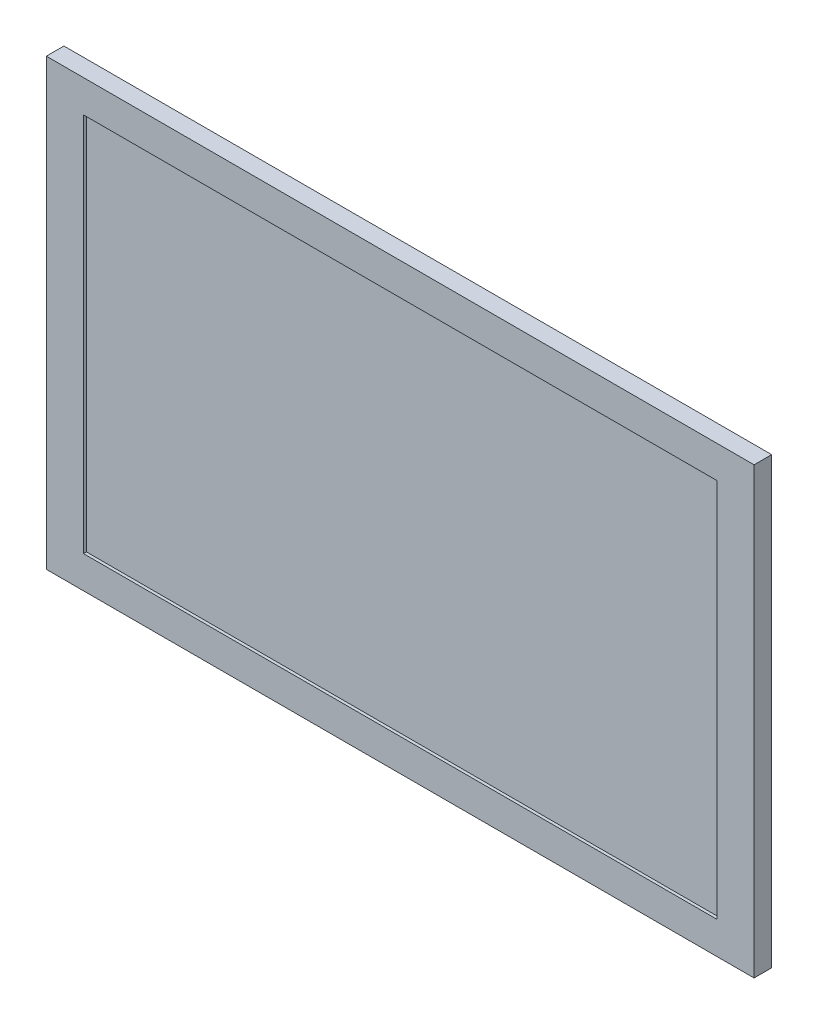
ISO-10303-21;
HEADER;
FILE_DESCRIPTION(('STEP AP214'),'2;1');
FILE_NAME('part.step','',(''),(''),'','','');
FILE_SCHEMA(('AUTOMOTIVE_DESIGN { 1 0 10303 214 1 1 1 1 }'));
ENDSEC;
DATA;
#1=APPLICATION_CONTEXT('core data for automotive mechanical design processes');
#2=APPLICATION_PROTOCOL_DEFINITION('international standard','automotive_design',2000,#1);
#3=PRODUCT_CONTEXT('',#1,'mechanical');
#4=PRODUCT('Part','Part','',(#3));
#5=PRODUCT_RELATED_PRODUCT_CATEGORY('part','',(#4));
#6=PRODUCT_DEFINITION_FORMATION('','',#4);
#7=PRODUCT_DEFINITION_CONTEXT('part definition',#1,'design');
#8=PRODUCT_DEFINITION('design','',#6,#7);
#9=PRODUCT_DEFINITION_SHAPE('','',#8);
#10=(LENGTH_UNIT() NAMED_UNIT(*) SI_UNIT(.MILLI.,.METRE.));
#11=(NAMED_UNIT(*) PLANE_ANGLE_UNIT() SI_UNIT($,.RADIAN.));
#12=(NAMED_UNIT(*) SI_UNIT($,.STERADIAN.) SOLID_ANGLE_UNIT());
#13=UNCERTAINTY_MEASURE_WITH_UNIT(LENGTH_MEASURE(1.E-05),#10,'distance_accuracy_value','');
#14=(GEOMETRIC_REPRESENTATION_CONTEXT(3) GLOBAL_UNCERTAINTY_ASSIGNED_CONTEXT((#13)) GLOBAL_UNIT_ASSIGNED_CONTEXT((#10,
#11,#12)) REPRESENTATION_CONTEXT('',''));
#15=CARTESIAN_POINT('',(0.,0.,0.));
#16=DIRECTION('',(0.,0.,1.));
#17=DIRECTION('',(1.,0.,0.));
#18=AXIS2_PLACEMENT_3D('',#15,#16,#17);
#19=CARTESIAN_POINT('',(60.35,37.9,1.5));
#20=DIRECTION('',(-1.,0.,0.));
#21=DIRECTION('',(0.,-1.,0.));
#22=AXIS2_PLACEMENT_3D('',#19,#20,#21);
#23=PLANE('',#22);
#24=DIRECTION('',(0.,1.,0.));
#25=VECTOR('',#24,1.);
#26=CARTESIAN_POINT('',(60.35,37.9,-1.5));
#27=LINE('',#26,#25);
#28=CARTESIAN_POINT('',(60.35,-37.9,-1.5));
#29=VERTEX_POINT('',#28);
#30=CARTESIAN_POINT('',(60.35,37.9,-1.5));
#31=VERTEX_POINT('',#30);
#32=EDGE_CURVE('E164',#29,#31,#27,.T.);
#33=ORIENTED_EDGE('',*,*,#32,.T.);
#34=DIRECTION('',(0.,0.,-1.));
#35=VECTOR('',#34,1.);
#36=CARTESIAN_POINT('',(60.35,37.9,1.5));
#37=LINE('',#36,#35);
#38=CARTESIAN_POINT('',(60.35,37.9,1.5));
#39=VERTEX_POINT('',#38);
#40=EDGE_CURVE('E11',#39,#31,#37,.T.);
#41=ORIENTED_EDGE('',*,*,#40,.F.);
#42=DIRECTION('',(0.,1.,0.));
#43=VECTOR('',#42,1.);
#44=CARTESIAN_POINT('',(60.35,37.9,1.5));
#45=LINE('',#44,#43);
#46=CARTESIAN_POINT('',(60.35,-37.9,1.5));
#47=VERTEX_POINT('',#46);
#48=EDGE_CURVE('E170',#47,#39,#45,.T.);
#49=ORIENTED_EDGE('',*,*,#48,.F.);
#50=DIRECTION('',(0.,0.,-1.));
#51=VECTOR('',#50,1.);
#52=CARTESIAN_POINT('',(60.35,-37.9,1.5));
#53=LINE('',#52,#51);
#54=EDGE_CURVE('E180',#47,#29,#53,.T.);
#55=ORIENTED_EDGE('',*,*,#54,.T.);
#56=EDGE_LOOP('',(#33,#41,#49,#55));
#57=FACE_BOUND('',#56,.T.);
#58=ADVANCED_FACE('F45',(#57),#23,.F.);
#59=CARTESIAN_POINT('',(-60.35,37.9,1.5));
#60=DIRECTION('',(0.,-1.,0.));
#61=DIRECTION('',(0.,0.,-1.));
#62=AXIS2_PLACEMENT_3D('',#59,#60,#61);
#63=PLANE('',#62);
#64=DIRECTION('',(-1.,0.,0.));
#65=VECTOR('',#64,1.);
#66=CARTESIAN_POINT('',(-60.35,37.9,-1.5));
#67=LINE('',#66,#65);
#68=CARTESIAN_POINT('',(-60.35,37.9,-1.5));
#69=VERTEX_POINT('',#68);
#70=EDGE_CURVE('E184',#31,#69,#67,.T.);
#71=ORIENTED_EDGE('',*,*,#70,.T.);
#72=DIRECTION('',(0.,0.,-1.));
#73=VECTOR('',#72,1.);
#74=CARTESIAN_POINT('',(-60.35,37.9,1.5));
#75=LINE('',#74,#73);
#76=CARTESIAN_POINT('',(-60.35,37.9,1.5));
#77=VERTEX_POINT('',#76);
#78=EDGE_CURVE('E53',#77,#69,#75,.T.);
#79=ORIENTED_EDGE('',*,*,#78,.F.);
#80=DIRECTION('',(-1.,0.,0.));
#81=VECTOR('',#80,1.);
#82=CARTESIAN_POINT('',(-60.35,37.9,1.5));
#83=LINE('',#82,#81);
#84=EDGE_CURVE('E97',#39,#77,#83,.T.);
#85=ORIENTED_EDGE('',*,*,#84,.F.);
#86=ORIENTED_EDGE('',*,*,#40,.T.);
#87=EDGE_LOOP('',(#71,#79,#85,#86));
#88=FACE_BOUND('',#87,.T.);
#89=ADVANCED_FACE('F220',(#88),#63,.F.);
#90=CARTESIAN_POINT('',(-60.35,37.9,1.5));
#91=DIRECTION('',(1.,0.,0.));
#92=DIRECTION('',(0.,1.,0.));
#93=AXIS2_PLACEMENT_3D('',#90,#91,#92);
#94=PLANE('',#93);
#95=DIRECTION('',(0.,-1.,0.));
#96=VECTOR('',#95,1.);
#97=CARTESIAN_POINT('',(-60.35,37.9,-1.5));
#98=LINE('',#97,#96);
#99=CARTESIAN_POINT('',(-60.35,-37.9,-1.5));
#100=VERTEX_POINT('',#99);
#101=EDGE_CURVE('E187',#69,#100,#98,.T.);
#102=ORIENTED_EDGE('',*,*,#101,.T.);
#103=DIRECTION('',(0.,0.,-1.));
#104=VECTOR('',#103,1.);
#105=CARTESIAN_POINT('',(-60.35,-37.9,1.5));
#106=LINE('',#105,#104);
#107=CARTESIAN_POINT('',(-60.35,-37.9,1.5));
#108=VERTEX_POINT('',#107);
#109=EDGE_CURVE('E194',#108,#100,#106,.T.);
#110=ORIENTED_EDGE('',*,*,#109,.F.);
#111=DIRECTION('',(0.,-1.,0.));
#112=VECTOR('',#111,1.);
#113=CARTESIAN_POINT('',(-60.35,37.9,1.5));
#114=LINE('',#113,#112);
#115=EDGE_CURVE('E175',#77,#108,#114,.T.);
#116=ORIENTED_EDGE('',*,*,#115,.F.);
#117=ORIENTED_EDGE('',*,*,#78,.T.);
#118=EDGE_LOOP('',(#102,#110,#116,#117));
#119=FACE_BOUND('',#118,.T.);
#120=ADVANCED_FACE('F201',(#119),#94,.F.);
#121=CARTESIAN_POINT('',(-60.35,-37.9,1.5));
#122=DIRECTION('',(0.,1.,0.));
#123=DIRECTION('',(0.,0.,1.));
#124=AXIS2_PLACEMENT_3D('',#121,#122,#123);
#125=PLANE('',#124);
#126=DIRECTION('',(1.,0.,0.));
#127=VECTOR('',#126,1.);
#128=CARTESIAN_POINT('',(-60.35,-37.9,-1.5));
#129=LINE('',#128,#127);
#130=EDGE_CURVE('E90',#100,#29,#129,.T.);
#131=ORIENTED_EDGE('',*,*,#130,.T.);
#132=ORIENTED_EDGE('',*,*,#54,.F.);
#133=DIRECTION('',(1.,0.,0.));
#134=VECTOR('',#133,1.);
#135=CARTESIAN_POINT('',(-60.35,-37.9,1.5));
#136=LINE('',#135,#134);
#137=EDGE_CURVE('E69',#108,#47,#136,.T.);
#138=ORIENTED_EDGE('',*,*,#137,.F.);
#139=ORIENTED_EDGE('',*,*,#109,.T.);
#140=EDGE_LOOP('',(#131,#132,#138,#139));
#141=FACE_BOUND('',#140,.T.);
#142=ADVANCED_FACE('F209',(#141),#125,.F.);
#143=CARTESIAN_POINT('',(0.,0.,1.5));
#144=DIRECTION('',(0.,0.,1.));
#145=DIRECTION('',(1.,0.,0.));
#146=AXIS2_PLACEMENT_3D('',#143,#144,#145);
#147=PLANE('',#146);
#148=DIRECTION('',(0.,1.,0.));
#149=VECTOR('',#148,1.);
#150=CARTESIAN_POINT('',(54.,32.4,1.5));
#151=LINE('',#150,#149);
#152=CARTESIAN_POINT('',(54.,-32.4,1.5));
#153=VERTEX_POINT('',#152);
#154=CARTESIAN_POINT('',(54.,32.4,1.5));
#155=VERTEX_POINT('',#154);
#156=EDGE_CURVE('E60',#153,#155,#151,.T.);
#157=ORIENTED_EDGE('',*,*,#156,.F.);
#158=DIRECTION('',(1.,0.,0.));
#159=VECTOR('',#158,1.);
#160=CARTESIAN_POINT('',(-54.,-32.4,1.5));
#161=LINE('',#160,#159);
#162=CARTESIAN_POINT('',(-54.,-32.4,1.5));
#163=VERTEX_POINT('',#162);
#164=EDGE_CURVE('E142',#163,#153,#161,.T.);
#165=ORIENTED_EDGE('',*,*,#164,.F.);
#166=DIRECTION('',(0.,-1.,0.));
#167=VECTOR('',#166,1.);
#168=CARTESIAN_POINT('',(-54.,32.4,1.5));
#169=LINE('',#168,#167);
#170=CARTESIAN_POINT('',(-54.,32.4,1.5));
#171=VERTEX_POINT('',#170);
#172=EDGE_CURVE('E146',#171,#163,#169,.T.);
#173=ORIENTED_EDGE('',*,*,#172,.F.);
#174=DIRECTION('',(-1.,0.,0.));
#175=VECTOR('',#174,1.);
#176=CARTESIAN_POINT('',(-54.,32.4,1.5));
#177=LINE('',#176,#175);
#178=EDGE_CURVE('E155',#155,#171,#177,.T.);
#179=ORIENTED_EDGE('',*,*,#178,.F.);
#180=EDGE_LOOP('',(#157,#165,#173,#179));
#181=FACE_BOUND('',#180,.T.);
#182=ORIENTED_EDGE('',*,*,#48,.T.);
#183=ORIENTED_EDGE('',*,*,#84,.T.);
#184=ORIENTED_EDGE('',*,*,#115,.T.);
#185=ORIENTED_EDGE('',*,*,#137,.T.);
#186=EDGE_LOOP('',(#182,#183,#184,#185));
#187=FACE_BOUND('',#186,.T.);
#188=ADVANCED_FACE('F211',(#181,#187),#147,.T.);
#189=CARTESIAN_POINT('',(0.,0.,-1.5));
#190=DIRECTION('',(0.,0.,1.));
#191=DIRECTION('',(1.,0.,0.));
#192=AXIS2_PLACEMENT_3D('',#189,#190,#191);
#193=PLANE('',#192);
#194=ORIENTED_EDGE('',*,*,#32,.F.);
#195=ORIENTED_EDGE('',*,*,#130,.F.);
#196=ORIENTED_EDGE('',*,*,#101,.F.);
#197=ORIENTED_EDGE('',*,*,#70,.F.);
#198=EDGE_LOOP('',(#194,#195,#196,#197));
#199=FACE_BOUND('',#198,.T.);
#200=ADVANCED_FACE('F205',(#199),#193,.F.);
#201=CARTESIAN_POINT('',(54.,32.4,1.));
#202=DIRECTION('',(1.,0.,0.));
#203=DIRECTION('',(0.,1.,0.));
#204=AXIS2_PLACEMENT_3D('',#201,#202,#203);
#205=PLANE('',#204);
#206=ORIENTED_EDGE('',*,*,#156,.T.);
#207=DIRECTION('',(0.,0.,1.));
#208=VECTOR('',#207,1.);
#209=CARTESIAN_POINT('',(54.,32.4,1.));
#210=LINE('',#209,#208);
#211=CARTESIAN_POINT('',(54.,32.4,1.));
#212=VERTEX_POINT('',#211);
#213=EDGE_CURVE('E117',#212,#155,#210,.T.);
#214=ORIENTED_EDGE('',*,*,#213,.F.);
#215=DIRECTION('',(0.,1.,0.));
#216=VECTOR('',#215,1.);
#217=CARTESIAN_POINT('',(54.,32.4,1.));
#218=LINE('',#217,#216);
#219=CARTESIAN_POINT('',(54.,-32.4,1.));
#220=VERTEX_POINT('',#219);
#221=EDGE_CURVE('E121',#220,#212,#218,.T.);
#222=ORIENTED_EDGE('',*,*,#221,.F.);
#223=DIRECTION('',(0.,0.,1.));
#224=VECTOR('',#223,1.);
#225=CARTESIAN_POINT('',(54.,-32.4,1.));
#226=LINE('',#225,#224);
#227=EDGE_CURVE('E161',#220,#153,#226,.T.);
#228=ORIENTED_EDGE('',*,*,#227,.T.);
#229=EDGE_LOOP('',(#206,#214,#222,#228));
#230=FACE_BOUND('',#229,.T.);
#231=ADVANCED_FACE('F119',(#230),#205,.F.);
#232=CARTESIAN_POINT('',(-54.,-32.4,1.));
#233=DIRECTION('',(0.,-1.,0.));
#234=DIRECTION('',(0.,0.,-1.));
#235=AXIS2_PLACEMENT_3D('',#232,#233,#234);
#236=PLANE('',#235);
#237=ORIENTED_EDGE('',*,*,#164,.T.);
#238=ORIENTED_EDGE('',*,*,#227,.F.);
#239=DIRECTION('',(1.,0.,0.));
#240=VECTOR('',#239,1.);
#241=CARTESIAN_POINT('',(-54.,-32.4,1.));
#242=LINE('',#241,#240);
#243=CARTESIAN_POINT('',(-54.,-32.4,1.));
#244=VERTEX_POINT('',#243);
#245=EDGE_CURVE('E128',#244,#220,#242,.T.);
#246=ORIENTED_EDGE('',*,*,#245,.F.);
#247=DIRECTION('',(0.,0.,1.));
#248=VECTOR('',#247,1.);
#249=CARTESIAN_POINT('',(-54.,-32.4,1.));
#250=LINE('',#249,#248);
#251=EDGE_CURVE('E165',#244,#163,#250,.T.);
#252=ORIENTED_EDGE('',*,*,#251,.T.);
#253=EDGE_LOOP('',(#237,#238,#246,#252));
#254=FACE_BOUND('',#253,.T.);
#255=ADVANCED_FACE('F260',(#254),#236,.F.);
#256=CARTESIAN_POINT('',(-54.,32.4,1.));
#257=DIRECTION('',(-1.,0.,0.));
#258=DIRECTION('',(0.,-1.,0.));
#259=AXIS2_PLACEMENT_3D('',#256,#257,#258);
#260=PLANE('',#259);
#261=ORIENTED_EDGE('',*,*,#172,.T.);
#262=ORIENTED_EDGE('',*,*,#251,.F.);
#263=DIRECTION('',(0.,-1.,0.));
#264=VECTOR('',#263,1.);
#265=CARTESIAN_POINT('',(-54.,32.4,1.));
#266=LINE('',#265,#264);
#267=CARTESIAN_POINT('',(-54.,32.4,1.));
#268=VERTEX_POINT('',#267);
#269=EDGE_CURVE('E137',#268,#244,#266,.T.);
#270=ORIENTED_EDGE('',*,*,#269,.F.);
#271=DIRECTION('',(0.,0.,1.));
#272=VECTOR('',#271,1.);
#273=CARTESIAN_POINT('',(-54.,32.4,1.));
#274=LINE('',#273,#272);
#275=EDGE_CURVE('E127',#268,#171,#274,.T.);
#276=ORIENTED_EDGE('',*,*,#275,.T.);
#277=EDGE_LOOP('',(#261,#262,#270,#276));
#278=FACE_BOUND('',#277,.T.);
#279=ADVANCED_FACE('F269',(#278),#260,.F.);
#280=CARTESIAN_POINT('',(-54.,32.4,1.));
#281=DIRECTION('',(0.,1.,0.));
#282=DIRECTION('',(0.,0.,1.));
#283=AXIS2_PLACEMENT_3D('',#280,#281,#282);
#284=PLANE('',#283);
#285=ORIENTED_EDGE('',*,*,#178,.T.);
#286=ORIENTED_EDGE('',*,*,#275,.F.);
#287=DIRECTION('',(-1.,0.,0.));
#288=VECTOR('',#287,1.);
#289=CARTESIAN_POINT('',(-54.,32.4,1.));
#290=LINE('',#289,#288);
#291=EDGE_CURVE('E131',#212,#268,#290,.T.);
#292=ORIENTED_EDGE('',*,*,#291,.F.);
#293=ORIENTED_EDGE('',*,*,#213,.T.);
#294=EDGE_LOOP('',(#285,#286,#292,#293));
#295=FACE_BOUND('',#294,.T.);
#296=ADVANCED_FACE('F132',(#295),#284,.F.);
#297=CARTESIAN_POINT('',(0.,0.,1.));
#298=DIRECTION('',(0.,0.,1.));
#299=DIRECTION('',(1.,0.,0.));
#300=AXIS2_PLACEMENT_3D('',#297,#298,#299);
#301=PLANE('',#300);
#302=ORIENTED_EDGE('',*,*,#221,.T.);
#303=ORIENTED_EDGE('',*,*,#291,.T.);
#304=ORIENTED_EDGE('',*,*,#269,.T.);
#305=ORIENTED_EDGE('',*,*,#245,.T.);
#306=EDGE_LOOP('',(#302,#303,#304,#305));
#307=FACE_BOUND('',#306,.T.);
#308=ADVANCED_FACE('F139',(#307),#301,.T.);
#309=CLOSED_SHELL('',(#58,#89,#120,#142,#188,#200,#231,#255,#279,#296,#308));
#310=MANIFOLD_SOLID_BREP('B2',#309);
#311=ADVANCED_BREP_SHAPE_REPRESENTATION('',(#18,#310),#14);
#312=SHAPE_DEFINITION_REPRESENTATION(#9,#311);
ENDSEC;
END-ISO-10303-21;
